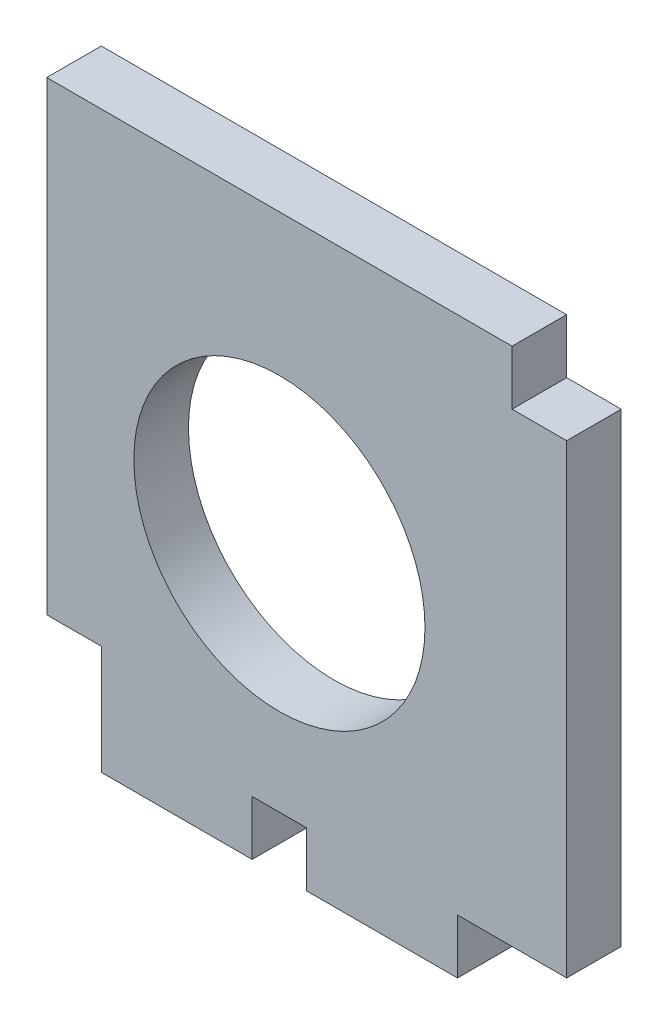
ISO-10303-21;
HEADER;
FILE_DESCRIPTION(('STEP AP214'),'2;1');
FILE_NAME('part.step','',(''),(''),'','','');
FILE_SCHEMA(('AUTOMOTIVE_DESIGN { 1 0 10303 214 1 1 1 1 }'));
ENDSEC;
DATA;
#1=APPLICATION_CONTEXT('core data for automotive mechanical design processes');
#2=APPLICATION_PROTOCOL_DEFINITION('international standard','automotive_design',2000,#1);
#3=PRODUCT_CONTEXT('',#1,'mechanical');
#4=PRODUCT('Part','Part','',(#3));
#5=PRODUCT_RELATED_PRODUCT_CATEGORY('part','',(#4));
#6=PRODUCT_DEFINITION_FORMATION('','',#4);
#7=PRODUCT_DEFINITION_CONTEXT('part definition',#1,'design');
#8=PRODUCT_DEFINITION('design','',#6,#7);
#9=PRODUCT_DEFINITION_SHAPE('','',#8);
#10=(LENGTH_UNIT() NAMED_UNIT(*) SI_UNIT(.MILLI.,.METRE.));
#11=(NAMED_UNIT(*) PLANE_ANGLE_UNIT() SI_UNIT($,.RADIAN.));
#12=(NAMED_UNIT(*) SI_UNIT($,.STERADIAN.) SOLID_ANGLE_UNIT());
#13=UNCERTAINTY_MEASURE_WITH_UNIT(LENGTH_MEASURE(1.E-05),#10,'distance_accuracy_value','');
#14=(GEOMETRIC_REPRESENTATION_CONTEXT(3) GLOBAL_UNCERTAINTY_ASSIGNED_CONTEXT((#13)) GLOBAL_UNIT_ASSIGNED_CONTEXT((#10,
#11,#12)) REPRESENTATION_CONTEXT('',''));
#15=CARTESIAN_POINT('',(0.,0.,0.));
#16=DIRECTION('',(0.,0.,1.));
#17=DIRECTION('',(1.,0.,0.));
#18=AXIS2_PLACEMENT_3D('',#15,#16,#17);
#19=CARTESIAN_POINT('',(0.,-25.0625,4.7625));
#20=DIRECTION('',(0.,-1.,0.));
#21=DIRECTION('',(1.,0.,0.));
#22=AXIS2_PLACEMENT_3D('',#19,#20,#21);
#23=PLANE('',#22);
#24=DIRECTION('',(-1.,0.,0.));
#25=VECTOR('',#24,1.);
#26=CARTESIAN_POINT('',(0.,-25.0625,0.));
#27=LINE('',#26,#25);
#28=CARTESIAN_POINT('',(-2.38125,-25.0625,0.));
#29=VERTEX_POINT('',#28);
#30=CARTESIAN_POINT('',(-15.5375,-25.0625,0.));
#31=VERTEX_POINT('',#30);
#32=EDGE_CURVE('E190',#29,#31,#27,.T.);
#33=ORIENTED_EDGE('',*,*,#32,.F.);
#34=DIRECTION('',(0.,0.,-1.));
#35=VECTOR('',#34,1.);
#36=CARTESIAN_POINT('',(-2.38125,-25.0625,4.7625));
#37=LINE('',#36,#35);
#38=CARTESIAN_POINT('',(-2.38125,-25.0625,4.7625));
#39=VERTEX_POINT('',#38);
#40=EDGE_CURVE('E186',#39,#29,#37,.T.);
#41=ORIENTED_EDGE('',*,*,#40,.F.);
#42=DIRECTION('',(-1.,0.,0.));
#43=VECTOR('',#42,1.);
#44=CARTESIAN_POINT('',(0.,-25.0625,4.7625));
#45=LINE('',#44,#43);
#46=CARTESIAN_POINT('',(-15.5375,-25.0625,4.7625));
#47=VERTEX_POINT('',#46);
#48=EDGE_CURVE('E189',#39,#47,#45,.T.);
#49=ORIENTED_EDGE('',*,*,#48,.T.);
#50=DIRECTION('',(0.,0.,-1.));
#51=VECTOR('',#50,1.);
#52=CARTESIAN_POINT('',(-15.5375,-25.0625,4.7625));
#53=LINE('',#52,#51);
#54=EDGE_CURVE('E183',#47,#31,#53,.T.);
#55=ORIENTED_EDGE('',*,*,#54,.T.);
#56=EDGE_LOOP('',(#33,#41,#49,#55));
#57=FACE_BOUND('',#56,.T.);
#58=ADVANCED_FACE('F95',(#57),#23,.T.);
#59=CARTESIAN_POINT('',(-15.5375,0.,4.7625));
#60=DIRECTION('',(-1.,0.,0.));
#61=DIRECTION('',(0.,0.,1.));
#62=AXIS2_PLACEMENT_3D('',#59,#60,#61);
#63=PLANE('',#62);
#64=DIRECTION('',(0.,1.,0.));
#65=VECTOR('',#64,1.);
#66=CARTESIAN_POINT('',(-15.5375,0.,0.));
#67=LINE('',#66,#65);
#68=CARTESIAN_POINT('',(-15.5375,-15.5375,0.));
#69=VERTEX_POINT('',#68);
#70=EDGE_CURVE('E194',#31,#69,#67,.T.);
#71=ORIENTED_EDGE('',*,*,#70,.F.);
#72=ORIENTED_EDGE('',*,*,#54,.F.);
#73=DIRECTION('',(0.,1.,0.));
#74=VECTOR('',#73,1.);
#75=CARTESIAN_POINT('',(-15.5375,0.,4.7625));
#76=LINE('',#75,#74);
#77=CARTESIAN_POINT('',(-15.5375,-15.5375,4.7625));
#78=VERTEX_POINT('',#77);
#79=EDGE_CURVE('E223',#47,#78,#76,.T.);
#80=ORIENTED_EDGE('',*,*,#79,.T.);
#81=DIRECTION('',(0.,0.,-1.));
#82=VECTOR('',#81,1.);
#83=CARTESIAN_POINT('',(-15.5375,-15.5375,4.7625));
#84=LINE('',#83,#82);
#85=EDGE_CURVE('E180',#78,#69,#84,.T.);
#86=ORIENTED_EDGE('',*,*,#85,.T.);
#87=EDGE_LOOP('',(#71,#72,#80,#86));
#88=FACE_BOUND('',#87,.T.);
#89=ADVANCED_FACE('F314',(#88),#63,.T.);
#90=CARTESIAN_POINT('',(0.,-15.5375,4.7625));
#91=DIRECTION('',(0.,1.,0.));
#92=DIRECTION('',(0.,0.,1.));
#93=AXIS2_PLACEMENT_3D('',#90,#91,#92);
#94=PLANE('',#93);
#95=DIRECTION('',(1.,0.,0.));
#96=VECTOR('',#95,1.);
#97=CARTESIAN_POINT('',(0.,-15.5375,0.));
#98=LINE('',#97,#96);
#99=CARTESIAN_POINT('',(-20.3,-15.5375,0.));
#100=VERTEX_POINT('',#99);
#101=EDGE_CURVE('E197',#100,#69,#98,.T.);
#102=ORIENTED_EDGE('',*,*,#101,.T.);
#103=ORIENTED_EDGE('',*,*,#85,.F.);
#104=DIRECTION('',(1.,0.,0.));
#105=VECTOR('',#104,1.);
#106=CARTESIAN_POINT('',(0.,-15.5375,4.7625));
#107=LINE('',#106,#105);
#108=CARTESIAN_POINT('',(-20.3,-15.5375,4.7625));
#109=VERTEX_POINT('',#108);
#110=EDGE_CURVE('E226',#109,#78,#107,.T.);
#111=ORIENTED_EDGE('',*,*,#110,.F.);
#112=DIRECTION('',(0.,0.,-1.));
#113=VECTOR('',#112,1.);
#114=CARTESIAN_POINT('',(-20.3,-15.5375,4.7625));
#115=LINE('',#114,#113);
#116=EDGE_CURVE('E177',#109,#100,#115,.T.);
#117=ORIENTED_EDGE('',*,*,#116,.T.);
#118=EDGE_LOOP('',(#102,#103,#111,#117));
#119=FACE_BOUND('',#118,.T.);
#120=ADVANCED_FACE('F344',(#119),#94,.F.);
#121=CARTESIAN_POINT('',(-20.3,0.,4.7625));
#122=DIRECTION('',(-1.,0.,0.));
#123=DIRECTION('',(0.,0.,1.));
#124=AXIS2_PLACEMENT_3D('',#121,#122,#123);
#125=PLANE('',#124);
#126=DIRECTION('',(0.,1.,0.));
#127=VECTOR('',#126,1.);
#128=CARTESIAN_POINT('',(-20.3,0.,0.));
#129=LINE('',#128,#127);
#130=CARTESIAN_POINT('',(-20.3,25.0625,0.));
#131=VERTEX_POINT('',#130);
#132=EDGE_CURVE('E200',#100,#131,#129,.T.);
#133=ORIENTED_EDGE('',*,*,#132,.F.);
#134=ORIENTED_EDGE('',*,*,#116,.F.);
#135=DIRECTION('',(0.,1.,0.));
#136=VECTOR('',#135,1.);
#137=CARTESIAN_POINT('',(-20.3,0.,4.7625));
#138=LINE('',#137,#136);
#139=CARTESIAN_POINT('',(-20.3,25.0625,4.7625));
#140=VERTEX_POINT('',#139);
#141=EDGE_CURVE('E229',#109,#140,#138,.T.);
#142=ORIENTED_EDGE('',*,*,#141,.T.);
#143=DIRECTION('',(0.,0.,-1.));
#144=VECTOR('',#143,1.);
#145=CARTESIAN_POINT('',(-20.3,25.0625,4.7625));
#146=LINE('',#145,#144);
#147=EDGE_CURVE('E174',#140,#131,#146,.T.);
#148=ORIENTED_EDGE('',*,*,#147,.T.);
#149=EDGE_LOOP('',(#133,#134,#142,#148));
#150=FACE_BOUND('',#149,.T.);
#151=ADVANCED_FACE('F347',(#150),#125,.T.);
#152=CARTESIAN_POINT('',(0.,-25.0625,4.7625));
#153=DIRECTION('',(0.,-1.,0.));
#154=DIRECTION('',(1.,0.,0.));
#155=AXIS2_PLACEMENT_3D('',#152,#153,#154);
#156=PLANE('',#155);
#157=DIRECTION('',(-1.,0.,0.));
#158=VECTOR('',#157,1.);
#159=CARTESIAN_POINT('',(0.,-25.0625,0.));
#160=LINE('',#159,#158);
#161=CARTESIAN_POINT('',(15.5375,-25.0625,0.));
#162=VERTEX_POINT('',#161);
#163=CARTESIAN_POINT('',(2.38125,-25.0625,0.));
#164=VERTEX_POINT('',#163);
#165=EDGE_CURVE('E210',#162,#164,#160,.T.);
#166=ORIENTED_EDGE('',*,*,#165,.F.);
#167=DIRECTION('',(0.,0.,-1.));
#168=VECTOR('',#167,1.);
#169=CARTESIAN_POINT('',(15.5375,-25.0625,4.7625));
#170=LINE('',#169,#168);
#171=CARTESIAN_POINT('',(15.5375,-25.0625,4.7625));
#172=VERTEX_POINT('',#171);
#173=EDGE_CURVE('E166',#172,#162,#170,.T.);
#174=ORIENTED_EDGE('',*,*,#173,.F.);
#175=DIRECTION('',(-1.,0.,0.));
#176=VECTOR('',#175,1.);
#177=CARTESIAN_POINT('',(0.,-25.0625,4.7625));
#178=LINE('',#177,#176);
#179=CARTESIAN_POINT('',(2.38125,-25.0625,4.7625));
#180=VERTEX_POINT('',#179);
#181=EDGE_CURVE('E242',#172,#180,#178,.T.);
#182=ORIENTED_EDGE('',*,*,#181,.T.);
#183=DIRECTION('',(0.,0.,-1.));
#184=VECTOR('',#183,1.);
#185=CARTESIAN_POINT('',(2.38125,-25.0625,4.7625));
#186=LINE('',#185,#184);
#187=EDGE_CURVE('E163',#180,#164,#186,.T.);
#188=ORIENTED_EDGE('',*,*,#187,.T.);
#189=EDGE_LOOP('',(#166,#174,#182,#188));
#190=FACE_BOUND('',#189,.T.);
#191=ADVANCED_FACE('F380',(#190),#156,.T.);
#192=CARTESIAN_POINT('',(2.38125,0.,4.7625));
#193=DIRECTION('',(1.,0.,0.));
#194=DIRECTION('',(0.,0.,-1.));
#195=AXIS2_PLACEMENT_3D('',#192,#193,#194);
#196=PLANE('',#195);
#197=DIRECTION('',(0.,-1.,0.));
#198=VECTOR('',#197,1.);
#199=CARTESIAN_POINT('',(2.38125,0.,0.));
#200=LINE('',#199,#198);
#201=CARTESIAN_POINT('',(2.38125,-20.3,0.));
#202=VERTEX_POINT('',#201);
#203=EDGE_CURVE('E213',#202,#164,#200,.T.);
#204=ORIENTED_EDGE('',*,*,#203,.T.);
#205=ORIENTED_EDGE('',*,*,#187,.F.);
#206=DIRECTION('',(0.,-1.,0.));
#207=VECTOR('',#206,1.);
#208=CARTESIAN_POINT('',(2.38125,0.,4.7625));
#209=LINE('',#208,#207);
#210=CARTESIAN_POINT('',(2.38125,-20.3,4.7625));
#211=VERTEX_POINT('',#210);
#212=EDGE_CURVE('E245',#211,#180,#209,.T.);
#213=ORIENTED_EDGE('',*,*,#212,.F.);
#214=DIRECTION('',(0.,0.,-1.));
#215=VECTOR('',#214,1.);
#216=CARTESIAN_POINT('',(2.38125,-20.3,4.7625));
#217=LINE('',#216,#215);
#218=EDGE_CURVE('E160',#211,#202,#217,.T.);
#219=ORIENTED_EDGE('',*,*,#218,.T.);
#220=EDGE_LOOP('',(#204,#205,#213,#219));
#221=FACE_BOUND('',#220,.T.);
#222=ADVANCED_FACE('F323',(#221),#196,.F.);
#223=CARTESIAN_POINT('',(0.,-20.3,4.7625));
#224=DIRECTION('',(0.,1.,0.));
#225=DIRECTION('',(-1.,0.,0.));
#226=AXIS2_PLACEMENT_3D('',#223,#224,#225);
#227=PLANE('',#226);
#228=DIRECTION('',(1.,0.,0.));
#229=VECTOR('',#228,1.);
#230=CARTESIAN_POINT('',(0.,-20.3,0.));
#231=LINE('',#230,#229);
#232=CARTESIAN_POINT('',(-2.38125,-20.3,0.));
#233=VERTEX_POINT('',#232);
#234=EDGE_CURVE('E216',#233,#202,#231,.T.);
#235=ORIENTED_EDGE('',*,*,#234,.T.);
#236=ORIENTED_EDGE('',*,*,#218,.F.);
#237=DIRECTION('',(1.,0.,0.));
#238=VECTOR('',#237,1.);
#239=CARTESIAN_POINT('',(0.,-20.3,4.7625));
#240=LINE('',#239,#238);
#241=CARTESIAN_POINT('',(-2.38125,-20.3,4.7625));
#242=VERTEX_POINT('',#241);
#243=EDGE_CURVE('E248',#242,#211,#240,.T.);
#244=ORIENTED_EDGE('',*,*,#243,.F.);
#245=DIRECTION('',(0.,0.,-1.));
#246=VECTOR('',#245,1.);
#247=CARTESIAN_POINT('',(-2.38125,-20.3,4.7625));
#248=LINE('',#247,#246);
#249=EDGE_CURVE('E105',#242,#233,#248,.T.);
#250=ORIENTED_EDGE('',*,*,#249,.T.);
#251=EDGE_LOOP('',(#235,#236,#244,#250));
#252=FACE_BOUND('',#251,.T.);
#253=ADVANCED_FACE('F320',(#252),#227,.F.);
#254=CARTESIAN_POINT('',(-2.38125,0.,4.7625));
#255=DIRECTION('',(1.,0.,0.));
#256=DIRECTION('',(0.,0.,-1.));
#257=AXIS2_PLACEMENT_3D('',#254,#255,#256);
#258=PLANE('',#257);
#259=DIRECTION('',(0.,-1.,0.));
#260=VECTOR('',#259,1.);
#261=CARTESIAN_POINT('',(-2.38125,0.,0.));
#262=LINE('',#261,#260);
#263=EDGE_CURVE('E219',#233,#29,#262,.T.);
#264=ORIENTED_EDGE('',*,*,#263,.F.);
#265=ORIENTED_EDGE('',*,*,#249,.F.);
#266=DIRECTION('',(0.,-1.,0.));
#267=VECTOR('',#266,1.);
#268=CARTESIAN_POINT('',(-2.38125,0.,4.7625));
#269=LINE('',#268,#267);
#270=EDGE_CURVE('E193',#242,#39,#269,.T.);
#271=ORIENTED_EDGE('',*,*,#270,.T.);
#272=ORIENTED_EDGE('',*,*,#40,.T.);
#273=EDGE_LOOP('',(#264,#265,#271,#272));
#274=FACE_BOUND('',#273,.T.);
#275=ADVANCED_FACE('F283',(#274),#258,.T.);
#276=CARTESIAN_POINT('',(15.5375,0.,4.7625));
#277=DIRECTION('',(-1.,0.,0.));
#278=DIRECTION('',(0.,0.,1.));
#279=AXIS2_PLACEMENT_3D('',#276,#277,#278);
#280=PLANE('',#279);
#281=DIRECTION('',(0.,1.,0.));
#282=VECTOR('',#281,1.);
#283=CARTESIAN_POINT('',(15.5375,0.,0.));
#284=LINE('',#283,#282);
#285=CARTESIAN_POINT('',(15.5375,-20.3,0.));
#286=VERTEX_POINT('',#285);
#287=EDGE_CURVE('E207',#162,#286,#284,.T.);
#288=ORIENTED_EDGE('',*,*,#287,.T.);
#289=DIRECTION('',(0.,0.,-1.));
#290=VECTOR('',#289,1.);
#291=CARTESIAN_POINT('',(15.5375,-20.3,4.7625));
#292=LINE('',#291,#290);
#293=CARTESIAN_POINT('',(15.5375,-20.3,4.7625));
#294=VERTEX_POINT('',#293);
#295=EDGE_CURVE('E169',#294,#286,#292,.T.);
#296=ORIENTED_EDGE('',*,*,#295,.F.);
#297=DIRECTION('',(0.,1.,0.));
#298=VECTOR('',#297,1.);
#299=CARTESIAN_POINT('',(15.5375,0.,4.7625));
#300=LINE('',#299,#298);
#301=EDGE_CURVE('E239',#172,#294,#300,.T.);
#302=ORIENTED_EDGE('',*,*,#301,.F.);
#303=ORIENTED_EDGE('',*,*,#173,.T.);
#304=EDGE_LOOP('',(#288,#296,#302,#303));
#305=FACE_BOUND('',#304,.T.);
#306=ADVANCED_FACE('F382',(#305),#280,.F.);
#307=CARTESIAN_POINT('',(0.,25.0625,4.7625));
#308=DIRECTION('',(0.,-1.,0.));
#309=DIRECTION('',(1.,0.,0.));
#310=AXIS2_PLACEMENT_3D('',#307,#308,#309);
#311=PLANE('',#310);
#312=DIRECTION('',(-1.,0.,0.));
#313=VECTOR('',#312,1.);
#314=CARTESIAN_POINT('',(0.,25.0625,0.));
#315=LINE('',#314,#313);
#316=CARTESIAN_POINT('',(20.3,25.0625,0.));
#317=VERTEX_POINT('',#316);
#318=EDGE_CURVE('E203',#317,#131,#315,.T.);
#319=ORIENTED_EDGE('',*,*,#318,.T.);
#320=ORIENTED_EDGE('',*,*,#147,.F.);
#321=DIRECTION('',(-1.,0.,0.));
#322=VECTOR('',#321,1.);
#323=CARTESIAN_POINT('',(0.,25.0625,4.7625));
#324=LINE('',#323,#322);
#325=CARTESIAN_POINT('',(20.3,25.0625,4.7625));
#326=VERTEX_POINT('',#325);
#327=EDGE_CURVE('E232',#326,#140,#324,.T.);
#328=ORIENTED_EDGE('',*,*,#327,.F.);
#329=DIRECTION('',(0.,0.,-1.));
#330=VECTOR('',#329,1.);
#331=CARTESIAN_POINT('',(20.3,25.0625,4.7625));
#332=LINE('',#331,#330);
#333=EDGE_CURVE('E171',#326,#317,#332,.T.);
#334=ORIENTED_EDGE('',*,*,#333,.T.);
#335=EDGE_LOOP('',(#319,#320,#328,#334));
#336=FACE_BOUND('',#335,.T.);
#337=ADVANCED_FACE('F351',(#336),#311,.F.);
#338=CARTESIAN_POINT('',(0.,0.,0.));
#339=DIRECTION('',(0.,0.,1.));
#340=DIRECTION('',(1.,0.,0.));
#341=AXIS2_PLACEMENT_3D('',#338,#339,#340);
#342=PLANE('',#341);
#343=CARTESIAN_POINT('',(0.,0.,0.));
#344=DIRECTION('',(0.,0.,1.));
#345=DIRECTION('',(1.,0.,0.));
#346=AXIS2_PLACEMENT_3D('',#343,#344,#345);
#347=CIRCLE('',#346,12.7);
#348=CARTESIAN_POINT('',(12.7,0.,0.));
#349=VERTEX_POINT('',#348);
#350=EDGE_CURVE('E146',#349,#349,#347,.T.);
#351=ORIENTED_EDGE('',*,*,#350,.T.);
#352=EDGE_LOOP('',(#351));
#353=FACE_BOUND('',#352,.T.);
#354=ORIENTED_EDGE('',*,*,#263,.T.);
#355=ORIENTED_EDGE('',*,*,#32,.T.);
#356=ORIENTED_EDGE('',*,*,#70,.T.);
#357=ORIENTED_EDGE('',*,*,#101,.F.);
#358=ORIENTED_EDGE('',*,*,#132,.T.);
#359=ORIENTED_EDGE('',*,*,#318,.F.);
#360=DIRECTION('',(0.,1.,0.));
#361=VECTOR('',#360,1.);
#362=CARTESIAN_POINT('',(20.3,0.,0.));
#363=LINE('',#362,#361);
#364=CARTESIAN_POINT('',(20.3,20.3,0.));
#365=VERTEX_POINT('',#364);
#366=EDGE_CURVE('E152',#365,#317,#363,.T.);
#367=ORIENTED_EDGE('',*,*,#366,.F.);
#368=DIRECTION('',(1.,0.,0.));
#369=VECTOR('',#368,1.);
#370=CARTESIAN_POINT('',(20.3,20.3,0.));
#371=LINE('',#370,#369);
#372=CARTESIAN_POINT('',(25.0625,20.3,0.));
#373=VERTEX_POINT('',#372);
#374=EDGE_CURVE('E137',#365,#373,#371,.T.);
#375=ORIENTED_EDGE('',*,*,#374,.T.);
#376=DIRECTION('',(0.,-1.,0.));
#377=VECTOR('',#376,1.);
#378=CARTESIAN_POINT('',(25.0625,20.3,0.));
#379=LINE('',#378,#377);
#380=CARTESIAN_POINT('',(25.0625,-20.3,0.));
#381=VERTEX_POINT('',#380);
#382=EDGE_CURVE('E144',#373,#381,#379,.T.);
#383=ORIENTED_EDGE('',*,*,#382,.T.);
#384=EDGE_CURVE('E130',#286,#381,#231,.T.);
#385=ORIENTED_EDGE('',*,*,#384,.F.);
#386=ORIENTED_EDGE('',*,*,#287,.F.);
#387=ORIENTED_EDGE('',*,*,#165,.T.);
#388=ORIENTED_EDGE('',*,*,#203,.F.);
#389=ORIENTED_EDGE('',*,*,#234,.F.);
#390=EDGE_LOOP('',(#354,#355,#356,#357,#358,#359,#367,#375,#383,#385,#386,#387,#388,#389));
#391=FACE_BOUND('',#390,.T.);
#392=ADVANCED_FACE('F149',(#353,#391),#342,.F.);
#393=CARTESIAN_POINT('',(0.,0.,4.7625));
#394=DIRECTION('',(0.,0.,1.));
#395=DIRECTION('',(1.,0.,0.));
#396=AXIS2_PLACEMENT_3D('',#393,#394,#395);
#397=PLANE('',#396);
#398=CARTESIAN_POINT('',(0.,0.,4.7625));
#399=DIRECTION('',(0.,0.,1.));
#400=DIRECTION('',(1.,0.,0.));
#401=AXIS2_PLACEMENT_3D('',#398,#399,#400);
#402=CIRCLE('',#401,12.7);
#403=CARTESIAN_POINT('',(12.7,0.,4.7625));
#404=VERTEX_POINT('',#403);
#405=EDGE_CURVE('E253',#404,#404,#402,.T.);
#406=ORIENTED_EDGE('',*,*,#405,.F.);
#407=EDGE_LOOP('',(#406));
#408=FACE_BOUND('',#407,.T.);
#409=ORIENTED_EDGE('',*,*,#270,.F.);
#410=ORIENTED_EDGE('',*,*,#243,.T.);
#411=ORIENTED_EDGE('',*,*,#212,.T.);
#412=ORIENTED_EDGE('',*,*,#181,.F.);
#413=ORIENTED_EDGE('',*,*,#301,.T.);
#414=CARTESIAN_POINT('',(25.0625,-20.3,4.7625));
#415=VERTEX_POINT('',#414);
#416=EDGE_CURVE('E238',#294,#415,#240,.T.);
#417=ORIENTED_EDGE('',*,*,#416,.T.);
#418=DIRECTION('',(0.,-1.,0.));
#419=VECTOR('',#418,1.);
#420=CARTESIAN_POINT('',(25.0625,20.3,4.7625));
#421=LINE('',#420,#419);
#422=CARTESIAN_POINT('',(25.0625,20.3,4.7625));
#423=VERTEX_POINT('',#422);
#424=EDGE_CURVE('E153',#423,#415,#421,.T.);
#425=ORIENTED_EDGE('',*,*,#424,.F.);
#426=DIRECTION('',(1.,0.,0.));
#427=VECTOR('',#426,1.);
#428=CARTESIAN_POINT('',(20.3,20.3,4.7625));
#429=LINE('',#428,#427);
#430=CARTESIAN_POINT('',(20.3,20.3,4.7625));
#431=VERTEX_POINT('',#430);
#432=EDGE_CURVE('E139',#431,#423,#429,.T.);
#433=ORIENTED_EDGE('',*,*,#432,.F.);
#434=DIRECTION('',(0.,1.,0.));
#435=VECTOR('',#434,1.);
#436=CARTESIAN_POINT('',(20.3,0.,4.7625));
#437=LINE('',#436,#435);
#438=EDGE_CURVE('E235',#431,#326,#437,.T.);
#439=ORIENTED_EDGE('',*,*,#438,.T.);
#440=ORIENTED_EDGE('',*,*,#327,.T.);
#441=ORIENTED_EDGE('',*,*,#141,.F.);
#442=ORIENTED_EDGE('',*,*,#110,.T.);
#443=ORIENTED_EDGE('',*,*,#79,.F.);
#444=ORIENTED_EDGE('',*,*,#48,.F.);
#445=EDGE_LOOP('',(#409,#410,#411,#412,#413,#417,#425,#433,#439,#440,#441,#442,#443,#444));
#446=FACE_BOUND('',#445,.T.);
#447=ADVANCED_FACE('F266',(#408,#446),#397,.T.);
#448=CARTESIAN_POINT('',(20.3,0.,4.7625));
#449=DIRECTION('',(-1.,0.,0.));
#450=DIRECTION('',(0.,0.,1.));
#451=AXIS2_PLACEMENT_3D('',#448,#449,#450);
#452=PLANE('',#451);
#453=ORIENTED_EDGE('',*,*,#438,.F.);
#454=DIRECTION('',(0.,0.,-1.));
#455=VECTOR('',#454,1.);
#456=CARTESIAN_POINT('',(20.3,20.3,4.7625));
#457=LINE('',#456,#455);
#458=EDGE_CURVE('E14',#431,#365,#457,.T.);
#459=ORIENTED_EDGE('',*,*,#458,.T.);
#460=ORIENTED_EDGE('',*,*,#366,.T.);
#461=ORIENTED_EDGE('',*,*,#333,.F.);
#462=EDGE_LOOP('',(#453,#459,#460,#461));
#463=FACE_BOUND('',#462,.T.);
#464=ADVANCED_FACE('F269',(#463),#452,.F.);
#465=ORIENTED_EDGE('',*,*,#384,.T.);
#466=DIRECTION('',(0.,0.,-1.));
#467=VECTOR('',#466,1.);
#468=CARTESIAN_POINT('',(25.0625,-20.3,4.7625));
#469=LINE('',#468,#467);
#470=EDGE_CURVE('E99',#415,#381,#469,.T.);
#471=ORIENTED_EDGE('',*,*,#470,.F.);
#472=ORIENTED_EDGE('',*,*,#416,.F.);
#473=ORIENTED_EDGE('',*,*,#295,.T.);
#474=EDGE_LOOP('',(#465,#471,#472,#473));
#475=FACE_BOUND('',#474,.T.);
#476=ADVANCED_FACE('F358',(#475),#227,.F.);
#477=CARTESIAN_POINT('',(25.0625,20.3,4.7625));
#478=DIRECTION('',(1.,0.,0.));
#479=DIRECTION('',(0.,1.,0.));
#480=AXIS2_PLACEMENT_3D('',#477,#478,#479);
#481=PLANE('',#480);
#482=ORIENTED_EDGE('',*,*,#382,.F.);
#483=DIRECTION('',(0.,0.,-1.));
#484=VECTOR('',#483,1.);
#485=CARTESIAN_POINT('',(25.0625,20.3,4.7625));
#486=LINE('',#485,#484);
#487=EDGE_CURVE('E133',#423,#373,#486,.T.);
#488=ORIENTED_EDGE('',*,*,#487,.F.);
#489=ORIENTED_EDGE('',*,*,#424,.T.);
#490=ORIENTED_EDGE('',*,*,#470,.T.);
#491=EDGE_LOOP('',(#482,#488,#489,#490));
#492=FACE_BOUND('',#491,.T.);
#493=ADVANCED_FACE('F97',(#492),#481,.T.);
#494=CARTESIAN_POINT('',(20.3,20.3,4.7625));
#495=DIRECTION('',(0.,1.,0.));
#496=DIRECTION('',(0.,0.,1.));
#497=AXIS2_PLACEMENT_3D('',#494,#495,#496);
#498=PLANE('',#497);
#499=ORIENTED_EDGE('',*,*,#374,.F.);
#500=ORIENTED_EDGE('',*,*,#458,.F.);
#501=ORIENTED_EDGE('',*,*,#432,.T.);
#502=ORIENTED_EDGE('',*,*,#487,.T.);
#503=EDGE_LOOP('',(#499,#500,#501,#502));
#504=FACE_BOUND('',#503,.T.);
#505=ADVANCED_FACE('F135',(#504),#498,.T.);
#506=CARTESIAN_POINT('',(0.,0.,0.));
#507=DIRECTION('',(0.,0.,1.));
#508=DIRECTION('',(1.,0.,0.));
#509=AXIS2_PLACEMENT_3D('',#506,#507,#508);
#510=CYLINDRICAL_SURFACE('',#509,12.7);
#511=CARTESIAN_POINT('',(12.7,0.,0.));
#512=CARTESIAN_POINT('',(12.7,0.,0.049609375));
#513=CARTESIAN_POINT('',(12.7,0.,0.09921875));
#514=CARTESIAN_POINT('',(12.7,0.,0.1984375));
#515=CARTESIAN_POINT('',(12.7,0.,0.248046875));
#516=CARTESIAN_POINT('',(12.7,0.,0.347265625));
#517=CARTESIAN_POINT('',(12.7,0.,0.396875));
#518=CARTESIAN_POINT('',(12.7,0.,0.49609375));
#519=CARTESIAN_POINT('',(12.7,0.,0.545703125));
#520=CARTESIAN_POINT('',(12.7,0.,0.644921875));
#521=CARTESIAN_POINT('',(12.7,0.,0.69453125));
#522=CARTESIAN_POINT('',(12.7,0.,0.79375));
#523=CARTESIAN_POINT('',(12.7,0.,0.843359375));
#524=CARTESIAN_POINT('',(12.7,0.,0.942578125));
#525=CARTESIAN_POINT('',(12.7,0.,0.9921875));
#526=CARTESIAN_POINT('',(12.7,0.,1.09140625));
#527=CARTESIAN_POINT('',(12.7,0.,1.141015625));
#528=CARTESIAN_POINT('',(12.7,0.,1.240234375));
#529=CARTESIAN_POINT('',(12.7,0.,1.28984375));
#530=CARTESIAN_POINT('',(12.7,0.,1.3890625));
#531=CARTESIAN_POINT('',(12.7,0.,1.438671875));
#532=CARTESIAN_POINT('',(12.7,0.,1.537890625));
#533=CARTESIAN_POINT('',(12.7,0.,1.5875));
#534=CARTESIAN_POINT('',(12.7,0.,1.68671875));
#535=CARTESIAN_POINT('',(12.7,0.,1.736328125));
#536=CARTESIAN_POINT('',(12.7,0.,1.835546875));
#537=CARTESIAN_POINT('',(12.7,0.,1.88515625));
#538=CARTESIAN_POINT('',(12.7,0.,1.984375));
#539=CARTESIAN_POINT('',(12.7,0.,2.033984375));
#540=CARTESIAN_POINT('',(12.7,0.,2.133203125));
#541=CARTESIAN_POINT('',(12.7,0.,2.1828125));
#542=CARTESIAN_POINT('',(12.7,0.,2.28203125));
#543=CARTESIAN_POINT('',(12.7,0.,2.331640625));
#544=CARTESIAN_POINT('',(12.7,0.,2.430859375));
#545=CARTESIAN_POINT('',(12.7,0.,2.48046875));
#546=CARTESIAN_POINT('',(12.7,0.,2.5796875));
#547=CARTESIAN_POINT('',(12.7,0.,2.629296875));
#548=CARTESIAN_POINT('',(12.7,0.,2.728515625));
#549=CARTESIAN_POINT('',(12.7,0.,2.778125));
#550=CARTESIAN_POINT('',(12.7,0.,2.87734375));
#551=CARTESIAN_POINT('',(12.7,0.,2.926953125));
#552=CARTESIAN_POINT('',(12.7,0.,3.026171875));
#553=CARTESIAN_POINT('',(12.7,0.,3.07578125));
#554=CARTESIAN_POINT('',(12.7,0.,3.175));
#555=CARTESIAN_POINT('',(12.7,0.,3.224609375));
#556=CARTESIAN_POINT('',(12.7,0.,3.323828125));
#557=CARTESIAN_POINT('',(12.7,0.,3.3734375));
#558=CARTESIAN_POINT('',(12.7,0.,3.47265625));
#559=CARTESIAN_POINT('',(12.7,0.,3.522265625));
#560=CARTESIAN_POINT('',(12.7,0.,3.621484375));
#561=CARTESIAN_POINT('',(12.7,0.,3.67109375));
#562=CARTESIAN_POINT('',(12.7,0.,3.7703125));
#563=CARTESIAN_POINT('',(12.7,0.,3.819921875));
#564=CARTESIAN_POINT('',(12.7,0.,3.919140625));
#565=CARTESIAN_POINT('',(12.7,0.,3.96875));
#566=CARTESIAN_POINT('',(12.7,0.,4.06796875));
#567=CARTESIAN_POINT('',(12.7,0.,4.117578125));
#568=CARTESIAN_POINT('',(12.7,0.,4.216796875));
#569=CARTESIAN_POINT('',(12.7,0.,4.26640625));
#570=CARTESIAN_POINT('',(12.7,0.,4.365625));
#571=CARTESIAN_POINT('',(12.7,0.,4.415234375));
#572=CARTESIAN_POINT('',(12.7,0.,4.514453125));
#573=CARTESIAN_POINT('',(12.7,0.,4.5640625));
#574=CARTESIAN_POINT('',(12.7,0.,4.66328125));
#575=CARTESIAN_POINT('',(12.7,0.,4.712890625));
#576=CARTESIAN_POINT('',(12.7,0.,4.7625));
#577=B_SPLINE_CURVE_WITH_KNOTS('',3,(#511,#512,#513,#514,#515,#516,#517,#518,#519,#520,#521,
#522,#523,#524,#525,#526,#527,#528,#529,#530,#531,#532,#533,#534,#535,#536,#537,#538,#539,#540,
#541,#542,#543,#544,#545,#546,#547,#548,#549,#550,#551,#552,#553,#554,#555,#556,#557,#558,#559,
#560,#561,#562,#563,#564,#565,#566,#567,#568,#569,#570,#571,#572,#573,#574,#575,#576),
.UNSPECIFIED.,.F.,.F.,(4,2,2,2,2,2,2,2,2,2,2,2,2,2,2,2,2,2,2,2,2,2,2,2,2,2,2,2,2,2,2,2,4),(0.,
0.148828125,0.29765625,0.446484375,0.5953125,0.744140625,0.89296875,1.041796875,1.190625,
1.339453125,1.48828125,1.637109375,1.7859375,1.934765625,2.08359375,2.232421875,2.38125,
2.530078125,2.67890625,2.827734375,2.9765625,3.125390625,3.27421875,3.423046875,3.571875,
3.720703125,3.86953125,4.018359375,4.1671875,4.316015625,4.46484375,4.613671875,4.7625),.UNSPECIFIED.);
#578=EDGE_CURVE('BSEAM260',#349,#404,#577,.T.);
#579=ORIENTED_EDGE('',*,*,#350,.F.);
#580=ORIENTED_EDGE('',*,*,#405,.T.);
#581=ORIENTED_EDGE('',*,*,#578,.T.);
#582=ORIENTED_EDGE('',*,*,#578,.F.);
#583=EDGE_LOOP('',(#579,#581,#580,#582));
#584=FACE_BOUND('',#583,.T.);
#585=ADVANCED_FACE('F260',(#584),#510,.F.);
#586=CLOSED_SHELL('',(#58,#89,#120,#151,#191,#222,#253,#275,#306,#337,#392,#447,#464,#476,#493,
#505,#585));
#587=MANIFOLD_SOLID_BREP('B2',#586);
#588=ADVANCED_BREP_SHAPE_REPRESENTATION('',(#18,#587),#14);
#589=SHAPE_DEFINITION_REPRESENTATION(#9,#588);
ENDSEC;
END-ISO-10303-21;
